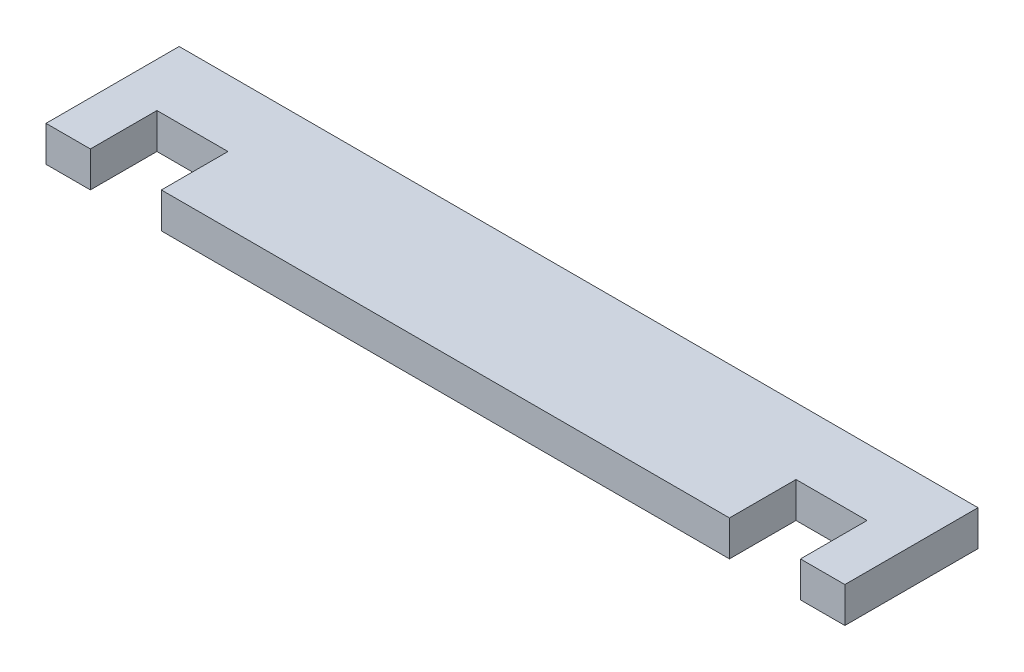
ISO-10303-21;
HEADER;
FILE_DESCRIPTION(('STEP AP214'),'2;1');
FILE_NAME('part.step','',(''),(''),'','','');
FILE_SCHEMA(('AUTOMOTIVE_DESIGN { 1 0 10303 214 1 1 1 1 }'));
ENDSEC;
DATA;
#1=APPLICATION_CONTEXT('core data for automotive mechanical design processes');
#2=APPLICATION_PROTOCOL_DEFINITION('international standard','automotive_design',2000,#1);
#3=PRODUCT_CONTEXT('',#1,'mechanical');
#4=PRODUCT('Part','Part','',(#3));
#5=PRODUCT_RELATED_PRODUCT_CATEGORY('part','',(#4));
#6=PRODUCT_DEFINITION_FORMATION('','',#4);
#7=PRODUCT_DEFINITION_CONTEXT('part definition',#1,'design');
#8=PRODUCT_DEFINITION('design','',#6,#7);
#9=PRODUCT_DEFINITION_SHAPE('','',#8);
#10=(LENGTH_UNIT() NAMED_UNIT(*) SI_UNIT(.MILLI.,.METRE.));
#11=(NAMED_UNIT(*) PLANE_ANGLE_UNIT() SI_UNIT($,.RADIAN.));
#12=(NAMED_UNIT(*) SI_UNIT($,.STERADIAN.) SOLID_ANGLE_UNIT());
#13=UNCERTAINTY_MEASURE_WITH_UNIT(LENGTH_MEASURE(1.E-05),#10,'distance_accuracy_value','');
#14=(GEOMETRIC_REPRESENTATION_CONTEXT(3) GLOBAL_UNCERTAINTY_ASSIGNED_CONTEXT((#13)) GLOBAL_UNIT_ASSIGNED_CONTEXT((#10,
#11,#12)) REPRESENTATION_CONTEXT('',''));
#15=CARTESIAN_POINT('',(0.,0.,0.));
#16=DIRECTION('',(0.,0.,1.));
#17=DIRECTION('',(1.,0.,0.));
#18=AXIS2_PLACEMENT_3D('',#15,#16,#17);
#19=CARTESIAN_POINT('',(-90.,8.,15.));
#20=DIRECTION('',(0.,0.,-1.));
#21=DIRECTION('',(-1.,0.,0.));
#22=AXIS2_PLACEMENT_3D('',#19,#20,#21);
#23=PLANE('',#22);
#24=DIRECTION('',(0.,1.,0.));
#25=VECTOR('',#24,1.);
#26=CARTESIAN_POINT('',(80.,0.,15.));
#27=LINE('',#26,#25);
#28=CARTESIAN_POINT('',(80.,0.,15.));
#29=VERTEX_POINT('',#28);
#30=CARTESIAN_POINT('',(80.,8.,15.));
#31=VERTEX_POINT('',#30);
#32=EDGE_CURVE('E151',#29,#31,#27,.T.);
#33=ORIENTED_EDGE('',*,*,#32,.F.);
#34=DIRECTION('',(1.,0.,0.));
#35=VECTOR('',#34,1.);
#36=CARTESIAN_POINT('',(-90.,0.,15.));
#37=LINE('',#36,#35);
#38=CARTESIAN_POINT('',(90.,0.,15.));
#39=VERTEX_POINT('',#38);
#40=EDGE_CURVE('E141',#29,#39,#37,.T.);
#41=ORIENTED_EDGE('',*,*,#40,.T.);
#42=DIRECTION('',(0.,-1.,0.));
#43=VECTOR('',#42,1.);
#44=CARTESIAN_POINT('',(90.,8.,15.));
#45=LINE('',#44,#43);
#46=CARTESIAN_POINT('',(90.,8.,15.));
#47=VERTEX_POINT('',#46);
#48=EDGE_CURVE('E194',#47,#39,#45,.T.);
#49=ORIENTED_EDGE('',*,*,#48,.F.);
#50=DIRECTION('',(1.,0.,0.));
#51=VECTOR('',#50,1.);
#52=CARTESIAN_POINT('',(-90.,8.,15.));
#53=LINE('',#52,#51);
#54=EDGE_CURVE('E190',#31,#47,#53,.T.);
#55=ORIENTED_EDGE('',*,*,#54,.F.);
#56=EDGE_LOOP('',(#33,#41,#49,#55));
#57=FACE_BOUND('',#56,.T.);
#58=ADVANCED_FACE('F33',(#57),#23,.F.);
#59=DIRECTION('',(0.,1.,0.));
#60=VECTOR('',#59,1.);
#61=CARTESIAN_POINT('',(64.,0.,15.));
#62=LINE('',#61,#60);
#63=CARTESIAN_POINT('',(64.,0.,15.));
#64=VERTEX_POINT('',#63);
#65=CARTESIAN_POINT('',(64.,8.,15.));
#66=VERTEX_POINT('',#65);
#67=EDGE_CURVE('E154',#64,#66,#62,.T.);
#68=ORIENTED_EDGE('',*,*,#67,.T.);
#69=CARTESIAN_POINT('',(-64.,8.,15.));
#70=VERTEX_POINT('',#69);
#71=EDGE_CURVE('E195',#70,#66,#53,.T.);
#72=ORIENTED_EDGE('',*,*,#71,.F.);
#73=DIRECTION('',(0.,1.,0.));
#74=VECTOR('',#73,1.);
#75=CARTESIAN_POINT('',(-64.,0.,15.));
#76=LINE('',#75,#74);
#77=CARTESIAN_POINT('',(-64.,0.,15.));
#78=VERTEX_POINT('',#77);
#79=EDGE_CURVE('E178',#78,#70,#76,.T.);
#80=ORIENTED_EDGE('',*,*,#79,.F.);
#81=EDGE_CURVE('E204',#78,#64,#37,.T.);
#82=ORIENTED_EDGE('',*,*,#81,.T.);
#83=EDGE_LOOP('',(#68,#72,#80,#82));
#84=FACE_BOUND('',#83,.T.);
#85=ADVANCED_FACE('F237',(#84),#23,.F.);
#86=CARTESIAN_POINT('',(0.,8.,0.));
#87=DIRECTION('',(0.,-1.,0.));
#88=DIRECTION('',(0.,0.,-1.));
#89=AXIS2_PLACEMENT_3D('',#86,#87,#88);
#90=PLANE('',#89);
#91=DIRECTION('',(0.,0.,1.));
#92=VECTOR('',#91,1.);
#93=CARTESIAN_POINT('',(80.,8.,15.));
#94=LINE('',#93,#92);
#95=CARTESIAN_POINT('',(80.,8.,0.));
#96=VERTEX_POINT('',#95);
#97=EDGE_CURVE('E135',#96,#31,#94,.T.);
#98=ORIENTED_EDGE('',*,*,#97,.T.);
#99=ORIENTED_EDGE('',*,*,#54,.T.);
#100=DIRECTION('',(0.,0.,-1.));
#101=VECTOR('',#100,1.);
#102=CARTESIAN_POINT('',(90.,8.,15.));
#103=LINE('',#102,#101);
#104=CARTESIAN_POINT('',(90.,8.,-15.));
#105=VERTEX_POINT('',#104);
#106=EDGE_CURVE('E182',#47,#105,#103,.T.);
#107=ORIENTED_EDGE('',*,*,#106,.T.);
#108=DIRECTION('',(-1.,0.,0.));
#109=VECTOR('',#108,1.);
#110=CARTESIAN_POINT('',(-90.,8.,-15.));
#111=LINE('',#110,#109);
#112=CARTESIAN_POINT('',(-90.,8.,-15.));
#113=VERTEX_POINT('',#112);
#114=EDGE_CURVE('E185',#105,#113,#111,.T.);
#115=ORIENTED_EDGE('',*,*,#114,.T.);
#116=DIRECTION('',(0.,0.,1.));
#117=VECTOR('',#116,1.);
#118=CARTESIAN_POINT('',(-90.,8.,15.));
#119=LINE('',#118,#117);
#120=CARTESIAN_POINT('',(-90.,8.,15.));
#121=VERTEX_POINT('',#120);
#122=EDGE_CURVE('E188',#113,#121,#119,.T.);
#123=ORIENTED_EDGE('',*,*,#122,.T.);
#124=CARTESIAN_POINT('',(-80.,8.,15.));
#125=VERTEX_POINT('',#124);
#126=EDGE_CURVE('E191',#121,#125,#53,.T.);
#127=ORIENTED_EDGE('',*,*,#126,.T.);
#128=DIRECTION('',(0.,0.,1.));
#129=VECTOR('',#128,1.);
#130=CARTESIAN_POINT('',(-80.,8.,15.));
#131=LINE('',#130,#129);
#132=CARTESIAN_POINT('',(-80.,8.,0.));
#133=VERTEX_POINT('',#132);
#134=EDGE_CURVE('E153',#133,#125,#131,.T.);
#135=ORIENTED_EDGE('',*,*,#134,.F.);
#136=DIRECTION('',(-1.,0.,0.));
#137=VECTOR('',#136,1.);
#138=CARTESIAN_POINT('',(-80.,8.,0.));
#139=LINE('',#138,#137);
#140=CARTESIAN_POINT('',(-64.,8.,0.));
#141=VERTEX_POINT('',#140);
#142=EDGE_CURVE('E162',#141,#133,#139,.T.);
#143=ORIENTED_EDGE('',*,*,#142,.F.);
#144=DIRECTION('',(0.,0.,-1.));
#145=VECTOR('',#144,1.);
#146=CARTESIAN_POINT('',(-64.,8.,15.));
#147=LINE('',#146,#145);
#148=EDGE_CURVE('E168',#70,#141,#147,.T.);
#149=ORIENTED_EDGE('',*,*,#148,.F.);
#150=ORIENTED_EDGE('',*,*,#71,.T.);
#151=DIRECTION('',(0.,0.,-1.));
#152=VECTOR('',#151,1.);
#153=CARTESIAN_POINT('',(64.,8.,15.));
#154=LINE('',#153,#152);
#155=CARTESIAN_POINT('',(64.,8.,0.));
#156=VERTEX_POINT('',#155);
#157=EDGE_CURVE('E142',#66,#156,#154,.T.);
#158=ORIENTED_EDGE('',*,*,#157,.T.);
#159=DIRECTION('',(1.,0.,0.));
#160=VECTOR('',#159,1.);
#161=CARTESIAN_POINT('',(80.,8.,0.));
#162=LINE('',#161,#160);
#163=EDGE_CURVE('E145',#156,#96,#162,.T.);
#164=ORIENTED_EDGE('',*,*,#163,.T.);
#165=EDGE_LOOP('',(#98,#99,#107,#115,#123,#127,#135,#143,#149,#150,#158,#164));
#166=FACE_BOUND('',#165,.T.);
#167=ADVANCED_FACE('F224',(#166),#90,.F.);
#168=CARTESIAN_POINT('',(0.,0.,0.));
#169=DIRECTION('',(0.,-1.,0.));
#170=DIRECTION('',(0.,0.,-1.));
#171=AXIS2_PLACEMENT_3D('',#168,#169,#170);
#172=PLANE('',#171);
#173=ORIENTED_EDGE('',*,*,#40,.F.);
#174=DIRECTION('',(0.,0.,1.));
#175=VECTOR('',#174,1.);
#176=CARTESIAN_POINT('',(80.,0.,15.));
#177=LINE('',#176,#175);
#178=CARTESIAN_POINT('',(80.,0.,0.));
#179=VERTEX_POINT('',#178);
#180=EDGE_CURVE('E129',#179,#29,#177,.T.);
#181=ORIENTED_EDGE('',*,*,#180,.F.);
#182=DIRECTION('',(1.,0.,0.));
#183=VECTOR('',#182,1.);
#184=CARTESIAN_POINT('',(80.,0.,0.));
#185=LINE('',#184,#183);
#186=CARTESIAN_POINT('',(64.,0.,0.));
#187=VERTEX_POINT('',#186);
#188=EDGE_CURVE('E120',#187,#179,#185,.T.);
#189=ORIENTED_EDGE('',*,*,#188,.F.);
#190=DIRECTION('',(0.,0.,-1.));
#191=VECTOR('',#190,1.);
#192=CARTESIAN_POINT('',(64.,0.,15.));
#193=LINE('',#192,#191);
#194=EDGE_CURVE('E128',#64,#187,#193,.T.);
#195=ORIENTED_EDGE('',*,*,#194,.F.);
#196=ORIENTED_EDGE('',*,*,#81,.F.);
#197=DIRECTION('',(0.,0.,-1.));
#198=VECTOR('',#197,1.);
#199=CARTESIAN_POINT('',(-64.,0.,15.));
#200=LINE('',#199,#198);
#201=CARTESIAN_POINT('',(-64.,0.,0.));
#202=VERTEX_POINT('',#201);
#203=EDGE_CURVE('E161',#78,#202,#200,.T.);
#204=ORIENTED_EDGE('',*,*,#203,.T.);
#205=DIRECTION('',(-1.,0.,0.));
#206=VECTOR('',#205,1.);
#207=CARTESIAN_POINT('',(-80.,0.,0.));
#208=LINE('',#207,#206);
#209=CARTESIAN_POINT('',(-80.,0.,0.));
#210=VERTEX_POINT('',#209);
#211=EDGE_CURVE('E56',#202,#210,#208,.T.);
#212=ORIENTED_EDGE('',*,*,#211,.T.);
#213=DIRECTION('',(0.,0.,1.));
#214=VECTOR('',#213,1.);
#215=CARTESIAN_POINT('',(-80.,0.,15.));
#216=LINE('',#215,#214);
#217=CARTESIAN_POINT('',(-80.,0.,15.));
#218=VERTEX_POINT('',#217);
#219=EDGE_CURVE('E158',#210,#218,#216,.T.);
#220=ORIENTED_EDGE('',*,*,#219,.T.);
#221=CARTESIAN_POINT('',(-90.,0.,15.));
#222=VERTEX_POINT('',#221);
#223=EDGE_CURVE('E186',#222,#218,#37,.T.);
#224=ORIENTED_EDGE('',*,*,#223,.F.);
#225=DIRECTION('',(0.,0.,1.));
#226=VECTOR('',#225,1.);
#227=CARTESIAN_POINT('',(-90.,0.,15.));
#228=LINE('',#227,#226);
#229=CARTESIAN_POINT('',(-90.,0.,-15.));
#230=VERTEX_POINT('',#229);
#231=EDGE_CURVE('E200',#230,#222,#228,.T.);
#232=ORIENTED_EDGE('',*,*,#231,.F.);
#233=DIRECTION('',(-1.,0.,0.));
#234=VECTOR('',#233,1.);
#235=CARTESIAN_POINT('',(-90.,0.,-15.));
#236=LINE('',#235,#234);
#237=CARTESIAN_POINT('',(90.,0.,-15.));
#238=VERTEX_POINT('',#237);
#239=EDGE_CURVE('E198',#238,#230,#236,.T.);
#240=ORIENTED_EDGE('',*,*,#239,.F.);
#241=DIRECTION('',(0.,0.,-1.));
#242=VECTOR('',#241,1.);
#243=CARTESIAN_POINT('',(90.,0.,15.));
#244=LINE('',#243,#242);
#245=EDGE_CURVE('E175',#39,#238,#244,.T.);
#246=ORIENTED_EDGE('',*,*,#245,.F.);
#247=EDGE_LOOP('',(#173,#181,#189,#195,#196,#204,#212,#220,#224,#232,#240,#246));
#248=FACE_BOUND('',#247,.T.);
#249=ADVANCED_FACE('F139',(#248),#172,.T.);
#250=ORIENTED_EDGE('',*,*,#223,.T.);
#251=DIRECTION('',(0.,1.,0.));
#252=VECTOR('',#251,1.);
#253=CARTESIAN_POINT('',(-80.,0.,15.));
#254=LINE('',#253,#252);
#255=EDGE_CURVE('E166',#218,#125,#254,.T.);
#256=ORIENTED_EDGE('',*,*,#255,.T.);
#257=ORIENTED_EDGE('',*,*,#126,.F.);
#258=DIRECTION('',(0.,-1.,0.));
#259=VECTOR('',#258,1.);
#260=CARTESIAN_POINT('',(-90.,8.,15.));
#261=LINE('',#260,#259);
#262=EDGE_CURVE('E207',#121,#222,#261,.T.);
#263=ORIENTED_EDGE('',*,*,#262,.T.);
#264=EDGE_LOOP('',(#250,#256,#257,#263));
#265=FACE_BOUND('',#264,.T.);
#266=ADVANCED_FACE('F220',(#265),#23,.F.);
#267=CARTESIAN_POINT('',(90.,8.,15.));
#268=DIRECTION('',(-1.,0.,0.));
#269=DIRECTION('',(0.,0.,1.));
#270=AXIS2_PLACEMENT_3D('',#267,#268,#269);
#271=PLANE('',#270);
#272=ORIENTED_EDGE('',*,*,#245,.T.);
#273=DIRECTION('',(0.,-1.,0.));
#274=VECTOR('',#273,1.);
#275=CARTESIAN_POINT('',(90.,8.,-15.));
#276=LINE('',#275,#274);
#277=EDGE_CURVE('E11',#105,#238,#276,.T.);
#278=ORIENTED_EDGE('',*,*,#277,.F.);
#279=ORIENTED_EDGE('',*,*,#106,.F.);
#280=ORIENTED_EDGE('',*,*,#48,.T.);
#281=EDGE_LOOP('',(#272,#278,#279,#280));
#282=FACE_BOUND('',#281,.T.);
#283=ADVANCED_FACE('F35',(#282),#271,.F.);
#284=CARTESIAN_POINT('',(-90.,8.,-15.));
#285=DIRECTION('',(0.,0.,1.));
#286=DIRECTION('',(1.,0.,0.));
#287=AXIS2_PLACEMENT_3D('',#284,#285,#286);
#288=PLANE('',#287);
#289=ORIENTED_EDGE('',*,*,#239,.T.);
#290=DIRECTION('',(0.,-1.,0.));
#291=VECTOR('',#290,1.);
#292=CARTESIAN_POINT('',(-90.,8.,-15.));
#293=LINE('',#292,#291);
#294=EDGE_CURVE('E41',#113,#230,#293,.T.);
#295=ORIENTED_EDGE('',*,*,#294,.F.);
#296=ORIENTED_EDGE('',*,*,#114,.F.);
#297=ORIENTED_EDGE('',*,*,#277,.T.);
#298=EDGE_LOOP('',(#289,#295,#296,#297));
#299=FACE_BOUND('',#298,.T.);
#300=ADVANCED_FACE('F228',(#299),#288,.F.);
#301=CARTESIAN_POINT('',(-90.,8.,15.));
#302=DIRECTION('',(1.,0.,0.));
#303=DIRECTION('',(0.,0.,-1.));
#304=AXIS2_PLACEMENT_3D('',#301,#302,#303);
#305=PLANE('',#304);
#306=ORIENTED_EDGE('',*,*,#231,.T.);
#307=ORIENTED_EDGE('',*,*,#262,.F.);
#308=ORIENTED_EDGE('',*,*,#122,.F.);
#309=ORIENTED_EDGE('',*,*,#294,.T.);
#310=EDGE_LOOP('',(#306,#307,#308,#309));
#311=FACE_BOUND('',#310,.T.);
#312=ADVANCED_FACE('F214',(#311),#305,.F.);
#313=CARTESIAN_POINT('',(-80.,0.,15.));
#314=DIRECTION('',(-1.,0.,0.));
#315=DIRECTION('',(0.,0.,1.));
#316=AXIS2_PLACEMENT_3D('',#313,#314,#315);
#317=PLANE('',#316);
#318=ORIENTED_EDGE('',*,*,#134,.T.);
#319=ORIENTED_EDGE('',*,*,#255,.F.);
#320=ORIENTED_EDGE('',*,*,#219,.F.);
#321=DIRECTION('',(0.,1.,0.));
#322=VECTOR('',#321,1.);
#323=CARTESIAN_POINT('',(-80.,0.,0.));
#324=LINE('',#323,#322);
#325=EDGE_CURVE('E173',#210,#133,#324,.T.);
#326=ORIENTED_EDGE('',*,*,#325,.T.);
#327=EDGE_LOOP('',(#318,#319,#320,#326));
#328=FACE_BOUND('',#327,.T.);
#329=ADVANCED_FACE('F247',(#328),#317,.F.);
#330=CARTESIAN_POINT('',(-80.,0.,0.));
#331=DIRECTION('',(0.,0.,-1.));
#332=DIRECTION('',(-1.,0.,0.));
#333=AXIS2_PLACEMENT_3D('',#330,#331,#332);
#334=PLANE('',#333);
#335=ORIENTED_EDGE('',*,*,#142,.T.);
#336=ORIENTED_EDGE('',*,*,#325,.F.);
#337=ORIENTED_EDGE('',*,*,#211,.F.);
#338=DIRECTION('',(0.,1.,0.));
#339=VECTOR('',#338,1.);
#340=CARTESIAN_POINT('',(-64.,0.,0.));
#341=LINE('',#340,#339);
#342=EDGE_CURVE('E176',#202,#141,#341,.T.);
#343=ORIENTED_EDGE('',*,*,#342,.T.);
#344=EDGE_LOOP('',(#335,#336,#337,#343));
#345=FACE_BOUND('',#344,.T.);
#346=ADVANCED_FACE('F245',(#345),#334,.F.);
#347=CARTESIAN_POINT('',(-64.,0.,15.));
#348=DIRECTION('',(1.,0.,0.));
#349=DIRECTION('',(0.,0.,-1.));
#350=AXIS2_PLACEMENT_3D('',#347,#348,#349);
#351=PLANE('',#350);
#352=ORIENTED_EDGE('',*,*,#148,.T.);
#353=ORIENTED_EDGE('',*,*,#342,.F.);
#354=ORIENTED_EDGE('',*,*,#203,.F.);
#355=ORIENTED_EDGE('',*,*,#79,.T.);
#356=EDGE_LOOP('',(#352,#353,#354,#355));
#357=FACE_BOUND('',#356,.T.);
#358=ADVANCED_FACE('F244',(#357),#351,.F.);
#359=CARTESIAN_POINT('',(80.,0.,15.));
#360=DIRECTION('',(-1.,0.,0.));
#361=DIRECTION('',(0.,0.,1.));
#362=AXIS2_PLACEMENT_3D('',#359,#360,#361);
#363=PLANE('',#362);
#364=ORIENTED_EDGE('',*,*,#97,.F.);
#365=DIRECTION('',(0.,1.,0.));
#366=VECTOR('',#365,1.);
#367=CARTESIAN_POINT('',(80.,0.,0.));
#368=LINE('',#367,#366);
#369=EDGE_CURVE('E123',#179,#96,#368,.T.);
#370=ORIENTED_EDGE('',*,*,#369,.F.);
#371=ORIENTED_EDGE('',*,*,#180,.T.);
#372=ORIENTED_EDGE('',*,*,#32,.T.);
#373=EDGE_LOOP('',(#364,#370,#371,#372));
#374=FACE_BOUND('',#373,.T.);
#375=ADVANCED_FACE('F132',(#374),#363,.T.);
#376=CARTESIAN_POINT('',(64.,0.,15.));
#377=DIRECTION('',(1.,0.,0.));
#378=DIRECTION('',(0.,0.,-1.));
#379=AXIS2_PLACEMENT_3D('',#376,#377,#378);
#380=PLANE('',#379);
#381=ORIENTED_EDGE('',*,*,#157,.F.);
#382=ORIENTED_EDGE('',*,*,#67,.F.);
#383=ORIENTED_EDGE('',*,*,#194,.T.);
#384=DIRECTION('',(0.,1.,0.));
#385=VECTOR('',#384,1.);
#386=CARTESIAN_POINT('',(64.,0.,0.));
#387=LINE('',#386,#385);
#388=EDGE_CURVE('E48',#187,#156,#387,.T.);
#389=ORIENTED_EDGE('',*,*,#388,.T.);
#390=EDGE_LOOP('',(#381,#382,#383,#389));
#391=FACE_BOUND('',#390,.T.);
#392=ADVANCED_FACE('F241',(#391),#380,.T.);
#393=CARTESIAN_POINT('',(80.,0.,0.));
#394=DIRECTION('',(0.,0.,1.));
#395=DIRECTION('',(1.,0.,0.));
#396=AXIS2_PLACEMENT_3D('',#393,#394,#395);
#397=PLANE('',#396);
#398=ORIENTED_EDGE('',*,*,#163,.F.);
#399=ORIENTED_EDGE('',*,*,#388,.F.);
#400=ORIENTED_EDGE('',*,*,#188,.T.);
#401=ORIENTED_EDGE('',*,*,#369,.T.);
#402=EDGE_LOOP('',(#398,#399,#400,#401));
#403=FACE_BOUND('',#402,.T.);
#404=ADVANCED_FACE('F122',(#403),#397,.T.);
#405=CLOSED_SHELL('',(#58,#85,#167,#249,#266,#283,#300,#312,#329,#346,#358,#375,#392,#404));
#406=MANIFOLD_SOLID_BREP('B2',#405);
#407=ADVANCED_BREP_SHAPE_REPRESENTATION('',(#18,#406),#14);
#408=SHAPE_DEFINITION_REPRESENTATION(#9,#407);
ENDSEC;
END-ISO-10303-21;
